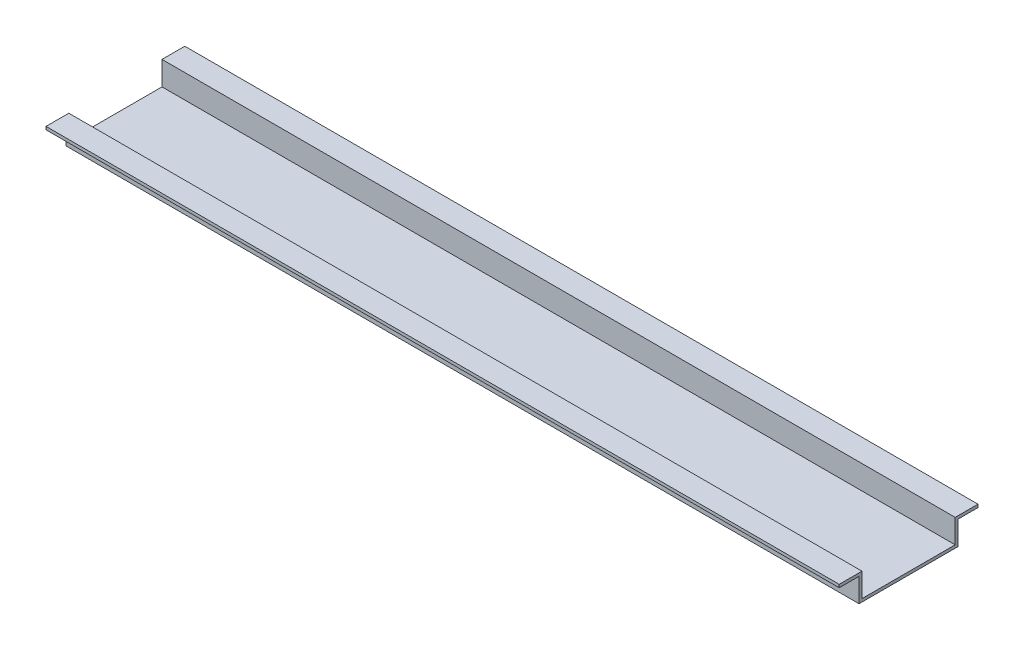
ISO-10303-21;
HEADER;
FILE_DESCRIPTION(('STEP AP214'),'2;1');
FILE_NAME('part.step','',(''),(''),'','','');
FILE_SCHEMA(('AUTOMOTIVE_DESIGN { 1 0 10303 214 1 1 1 1 }'));
ENDSEC;
DATA;
#1=APPLICATION_CONTEXT('core data for automotive mechanical design processes');
#2=APPLICATION_PROTOCOL_DEFINITION('international standard','automotive_design',2000,#1);
#3=PRODUCT_CONTEXT('',#1,'mechanical');
#4=PRODUCT('Part','Part','',(#3));
#5=PRODUCT_RELATED_PRODUCT_CATEGORY('part','',(#4));
#6=PRODUCT_DEFINITION_FORMATION('','',#4);
#7=PRODUCT_DEFINITION_CONTEXT('part definition',#1,'design');
#8=PRODUCT_DEFINITION('design','',#6,#7);
#9=PRODUCT_DEFINITION_SHAPE('','',#8);
#10=(LENGTH_UNIT() NAMED_UNIT(*) SI_UNIT(.MILLI.,.METRE.));
#11=(NAMED_UNIT(*) PLANE_ANGLE_UNIT() SI_UNIT($,.RADIAN.));
#12=(NAMED_UNIT(*) SI_UNIT($,.STERADIAN.) SOLID_ANGLE_UNIT());
#13=UNCERTAINTY_MEASURE_WITH_UNIT(LENGTH_MEASURE(1.E-05),#10,'distance_accuracy_value','');
#14=(GEOMETRIC_REPRESENTATION_CONTEXT(3) GLOBAL_UNCERTAINTY_ASSIGNED_CONTEXT((#13)) GLOBAL_UNIT_ASSIGNED_CONTEXT((#10,
#11,#12)) REPRESENTATION_CONTEXT('',''));
#15=CARTESIAN_POINT('',(0.,0.,0.));
#16=DIRECTION('',(0.,0.,1.));
#17=DIRECTION('',(1.,0.,0.));
#18=AXIS2_PLACEMENT_3D('',#15,#16,#17);
#19=CARTESIAN_POINT('',(271.289901108082,498.5,865.));
#20=DIRECTION('',(0.,0.,1.));
#21=DIRECTION('',(1.,0.,0.));
#22=AXIS2_PLACEMENT_3D('',#19,#20,#21);
#23=PLANE('',#22);
#24=DIRECTION('',(-1.,0.,0.));
#25=VECTOR('',#24,1.);
#26=CARTESIAN_POINT('',(271.289901108082,497.,865.));
#27=LINE('',#26,#25);
#28=CARTESIAN_POINT('',(200.,497.,865.));
#29=VERTEX_POINT('',#28);
#30=CARTESIAN_POINT('',(-200.,497.,865.));
#31=VERTEX_POINT('',#30);
#32=EDGE_CURVE('E158',#29,#31,#27,.T.);
#33=ORIENTED_EDGE('',*,*,#32,.T.);
#34=DIRECTION('',(0.,1.,0.));
#35=VECTOR('',#34,1.);
#36=CARTESIAN_POINT('',(-200.,498.5,865.));
#37=LINE('',#36,#35);
#38=CARTESIAN_POINT('',(-200.,498.5,865.));
#39=VERTEX_POINT('',#38);
#40=EDGE_CURVE('E155',#31,#39,#37,.T.);
#41=ORIENTED_EDGE('',*,*,#40,.T.);
#42=DIRECTION('',(-1.,0.,0.));
#43=VECTOR('',#42,1.);
#44=CARTESIAN_POINT('',(271.289901108082,498.5,865.));
#45=LINE('',#44,#43);
#46=CARTESIAN_POINT('',(200.,498.5,865.));
#47=VERTEX_POINT('',#46);
#48=EDGE_CURVE('E201',#47,#39,#45,.T.);
#49=ORIENTED_EDGE('',*,*,#48,.F.);
#50=DIRECTION('',(0.,1.,0.));
#51=VECTOR('',#50,1.);
#52=CARTESIAN_POINT('',(200.,498.5,865.));
#53=LINE('',#52,#51);
#54=EDGE_CURVE('E19',#29,#47,#53,.T.);
#55=ORIENTED_EDGE('',*,*,#54,.F.);
#56=EDGE_LOOP('',(#33,#41,#49,#55));
#57=FACE_BOUND('',#56,.T.);
#58=ADVANCED_FACE('F15',(#57),#23,.F.);
#59=CARTESIAN_POINT('',(271.289901108082,498.5,875.));
#60=DIRECTION('',(0.,-1.,0.));
#61=DIRECTION('',(0.,0.,1.));
#62=AXIS2_PLACEMENT_3D('',#59,#60,#61);
#63=PLANE('',#62);
#64=ORIENTED_EDGE('',*,*,#48,.T.);
#65=DIRECTION('',(0.,0.,1.));
#66=VECTOR('',#65,1.);
#67=CARTESIAN_POINT('',(-200.,498.5,875.));
#68=LINE('',#67,#66);
#69=CARTESIAN_POINT('',(-200.,498.5,876.5));
#70=VERTEX_POINT('',#69);
#71=EDGE_CURVE('E152',#39,#70,#68,.T.);
#72=ORIENTED_EDGE('',*,*,#71,.T.);
#73=DIRECTION('',(-1.,0.,0.));
#74=VECTOR('',#73,1.);
#75=CARTESIAN_POINT('',(271.289901108082,498.5,876.5));
#76=LINE('',#75,#74);
#77=CARTESIAN_POINT('',(200.,498.5,876.5));
#78=VERTEX_POINT('',#77);
#79=EDGE_CURVE('E199',#78,#70,#76,.T.);
#80=ORIENTED_EDGE('',*,*,#79,.F.);
#81=DIRECTION('',(0.,0.,1.));
#82=VECTOR('',#81,1.);
#83=CARTESIAN_POINT('',(200.,498.5,875.));
#84=LINE('',#83,#82);
#85=EDGE_CURVE('E160',#47,#78,#84,.T.);
#86=ORIENTED_EDGE('',*,*,#85,.F.);
#87=EDGE_LOOP('',(#64,#72,#80,#86));
#88=FACE_BOUND('',#87,.T.);
#89=ADVANCED_FACE('F212',(#88),#63,.F.);
#90=CARTESIAN_POINT('',(271.289901108082,485.,876.5));
#91=DIRECTION('',(0.,0.,-1.));
#92=DIRECTION('',(0.,-1.,0.));
#93=AXIS2_PLACEMENT_3D('',#90,#91,#92);
#94=PLANE('',#93);
#95=ORIENTED_EDGE('',*,*,#79,.T.);
#96=DIRECTION('',(0.,-1.,0.));
#97=VECTOR('',#96,1.);
#98=CARTESIAN_POINT('',(-200.,485.,876.5));
#99=LINE('',#98,#97);
#100=CARTESIAN_POINT('',(-200.,486.5,876.5));
#101=VERTEX_POINT('',#100);
#102=EDGE_CURVE('E149',#70,#101,#99,.T.);
#103=ORIENTED_EDGE('',*,*,#102,.T.);
#104=DIRECTION('',(-1.,0.,0.));
#105=VECTOR('',#104,1.);
#106=CARTESIAN_POINT('',(271.289901108082,486.5,876.5));
#107=LINE('',#106,#105);
#108=CARTESIAN_POINT('',(200.,486.5,876.5));
#109=VERTEX_POINT('',#108);
#110=EDGE_CURVE('E197',#109,#101,#107,.T.);
#111=ORIENTED_EDGE('',*,*,#110,.F.);
#112=DIRECTION('',(0.,-1.,0.));
#113=VECTOR('',#112,1.);
#114=CARTESIAN_POINT('',(200.,485.,876.5));
#115=LINE('',#114,#113);
#116=EDGE_CURVE('E32',#78,#109,#115,.T.);
#117=ORIENTED_EDGE('',*,*,#116,.F.);
#118=EDGE_LOOP('',(#95,#103,#111,#117));
#119=FACE_BOUND('',#118,.T.);
#120=ADVANCED_FACE('F233',(#119),#94,.F.);
#121=CARTESIAN_POINT('',(271.289901108082,486.5,875.000000000001));
#122=DIRECTION('',(0.,-1.,0.));
#123=DIRECTION('',(0.,0.,1.));
#124=AXIS2_PLACEMENT_3D('',#121,#122,#123);
#125=PLANE('',#124);
#126=ORIENTED_EDGE('',*,*,#110,.T.);
#127=DIRECTION('',(0.,0.,1.));
#128=VECTOR('',#127,1.);
#129=CARTESIAN_POINT('',(-200.,486.5,875.));
#130=LINE('',#129,#128);
#131=CARTESIAN_POINT('',(-200.,486.5,923.5));
#132=VERTEX_POINT('',#131);
#133=EDGE_CURVE('E146',#101,#132,#130,.T.);
#134=ORIENTED_EDGE('',*,*,#133,.T.);
#135=DIRECTION('',(-1.,0.,0.));
#136=VECTOR('',#135,1.);
#137=CARTESIAN_POINT('',(271.289901108082,486.5,923.500000000001));
#138=LINE('',#137,#136);
#139=CARTESIAN_POINT('',(200.,486.5,923.500000000001));
#140=VERTEX_POINT('',#139);
#141=EDGE_CURVE('E194',#140,#132,#138,.T.);
#142=ORIENTED_EDGE('',*,*,#141,.F.);
#143=DIRECTION('',(0.,0.,1.));
#144=VECTOR('',#143,1.);
#145=CARTESIAN_POINT('',(200.,486.5,875.000000000001));
#146=LINE('',#145,#144);
#147=EDGE_CURVE('E40',#109,#140,#146,.T.);
#148=ORIENTED_EDGE('',*,*,#147,.F.);
#149=EDGE_LOOP('',(#126,#134,#142,#148));
#150=FACE_BOUND('',#149,.T.);
#151=ADVANCED_FACE('F232',(#150),#125,.F.);
#152=CARTESIAN_POINT('',(271.289901108082,485.,923.500000000001));
#153=DIRECTION('',(0.,0.,1.));
#154=DIRECTION('',(1.,0.,0.));
#155=AXIS2_PLACEMENT_3D('',#152,#153,#154);
#156=PLANE('',#155);
#157=ORIENTED_EDGE('',*,*,#141,.T.);
#158=DIRECTION('',(0.,1.,0.));
#159=VECTOR('',#158,1.);
#160=CARTESIAN_POINT('',(-200.,485.,923.5));
#161=LINE('',#160,#159);
#162=CARTESIAN_POINT('',(-200.,498.5,923.5));
#163=VERTEX_POINT('',#162);
#164=EDGE_CURVE('E143',#132,#163,#161,.T.);
#165=ORIENTED_EDGE('',*,*,#164,.T.);
#166=DIRECTION('',(-1.,0.,0.));
#167=VECTOR('',#166,1.);
#168=CARTESIAN_POINT('',(271.289901108082,498.5,923.500000000001));
#169=LINE('',#168,#167);
#170=CARTESIAN_POINT('',(200.,498.5,923.500000000001));
#171=VERTEX_POINT('',#170);
#172=EDGE_CURVE('E191',#171,#163,#169,.T.);
#173=ORIENTED_EDGE('',*,*,#172,.F.);
#174=DIRECTION('',(0.,1.,0.));
#175=VECTOR('',#174,1.);
#176=CARTESIAN_POINT('',(200.,485.,923.500000000001));
#177=LINE('',#176,#175);
#178=EDGE_CURVE('E164',#140,#171,#177,.T.);
#179=ORIENTED_EDGE('',*,*,#178,.F.);
#180=EDGE_LOOP('',(#157,#165,#173,#179));
#181=FACE_BOUND('',#180,.T.);
#182=ADVANCED_FACE('F231',(#181),#156,.F.);
#183=CARTESIAN_POINT('',(271.289901108082,498.5,925.000000000001));
#184=DIRECTION('',(0.,-1.,0.));
#185=DIRECTION('',(0.,0.,1.));
#186=AXIS2_PLACEMENT_3D('',#183,#184,#185);
#187=PLANE('',#186);
#188=ORIENTED_EDGE('',*,*,#172,.T.);
#189=DIRECTION('',(0.,0.,1.));
#190=VECTOR('',#189,1.);
#191=CARTESIAN_POINT('',(-200.,498.5,925.));
#192=LINE('',#191,#190);
#193=CARTESIAN_POINT('',(-200.,498.5,935.));
#194=VERTEX_POINT('',#193);
#195=EDGE_CURVE('E140',#163,#194,#192,.T.);
#196=ORIENTED_EDGE('',*,*,#195,.T.);
#197=DIRECTION('',(-1.,0.,0.));
#198=VECTOR('',#197,1.);
#199=CARTESIAN_POINT('',(271.289901108082,498.5,935.000000000001));
#200=LINE('',#199,#198);
#201=CARTESIAN_POINT('',(200.,498.5,935.000000000001));
#202=VERTEX_POINT('',#201);
#203=EDGE_CURVE('E188',#202,#194,#200,.T.);
#204=ORIENTED_EDGE('',*,*,#203,.F.);
#205=DIRECTION('',(0.,0.,1.));
#206=VECTOR('',#205,1.);
#207=CARTESIAN_POINT('',(200.,498.5,925.000000000001));
#208=LINE('',#207,#206);
#209=EDGE_CURVE('E167',#171,#202,#208,.T.);
#210=ORIENTED_EDGE('',*,*,#209,.F.);
#211=EDGE_LOOP('',(#188,#196,#204,#210));
#212=FACE_BOUND('',#211,.T.);
#213=ADVANCED_FACE('F228',(#212),#187,.F.);
#214=CARTESIAN_POINT('',(271.289901108082,497.,935.000000000001));
#215=DIRECTION('',(0.,0.,-1.));
#216=DIRECTION('',(-1.,0.,0.));
#217=AXIS2_PLACEMENT_3D('',#214,#215,#216);
#218=PLANE('',#217);
#219=ORIENTED_EDGE('',*,*,#203,.T.);
#220=DIRECTION('',(0.,-1.,0.));
#221=VECTOR('',#220,1.);
#222=CARTESIAN_POINT('',(-200.,497.,935.));
#223=LINE('',#222,#221);
#224=CARTESIAN_POINT('',(-200.,497.,935.));
#225=VERTEX_POINT('',#224);
#226=EDGE_CURVE('E137',#194,#225,#223,.T.);
#227=ORIENTED_EDGE('',*,*,#226,.T.);
#228=DIRECTION('',(-1.,0.,0.));
#229=VECTOR('',#228,1.);
#230=CARTESIAN_POINT('',(271.289901108082,497.,935.000000000001));
#231=LINE('',#230,#229);
#232=CARTESIAN_POINT('',(200.,497.,935.000000000001));
#233=VERTEX_POINT('',#232);
#234=EDGE_CURVE('E185',#233,#225,#231,.T.);
#235=ORIENTED_EDGE('',*,*,#234,.F.);
#236=DIRECTION('',(0.,-1.,0.));
#237=VECTOR('',#236,1.);
#238=CARTESIAN_POINT('',(200.,497.,935.000000000001));
#239=LINE('',#238,#237);
#240=EDGE_CURVE('E170',#202,#233,#239,.T.);
#241=ORIENTED_EDGE('',*,*,#240,.F.);
#242=EDGE_LOOP('',(#219,#227,#235,#241));
#243=FACE_BOUND('',#242,.T.);
#244=ADVANCED_FACE('F225',(#243),#218,.F.);
#245=CARTESIAN_POINT('',(271.289901108082,497.,925.000000000001));
#246=DIRECTION('',(0.,-1.,0.));
#247=DIRECTION('',(0.,0.,1.));
#248=AXIS2_PLACEMENT_3D('',#245,#246,#247);
#249=PLANE('',#248);
#250=DIRECTION('',(0.,0.,1.));
#251=VECTOR('',#250,1.);
#252=CARTESIAN_POINT('',(200.,497.,925.000000000001));
#253=LINE('',#252,#251);
#254=CARTESIAN_POINT('',(200.,497.,925.));
#255=VERTEX_POINT('',#254);
#256=EDGE_CURVE('E173',#255,#233,#253,.T.);
#257=ORIENTED_EDGE('',*,*,#256,.T.);
#258=ORIENTED_EDGE('',*,*,#234,.T.);
#259=DIRECTION('',(0.,0.,1.));
#260=VECTOR('',#259,1.);
#261=CARTESIAN_POINT('',(-200.,497.,925.));
#262=LINE('',#261,#260);
#263=CARTESIAN_POINT('',(-200.,497.,925.));
#264=VERTEX_POINT('',#263);
#265=EDGE_CURVE('E133',#264,#225,#262,.T.);
#266=ORIENTED_EDGE('',*,*,#265,.F.);
#267=DIRECTION('',(-1.,0.,0.));
#268=VECTOR('',#267,1.);
#269=CARTESIAN_POINT('',(271.289901108082,497.,925.000000000001));
#270=LINE('',#269,#268);
#271=EDGE_CURVE('E182',#255,#264,#270,.T.);
#272=ORIENTED_EDGE('',*,*,#271,.F.);
#273=EDGE_LOOP('',(#257,#258,#266,#272));
#274=FACE_BOUND('',#273,.T.);
#275=ADVANCED_FACE('F223',(#274),#249,.T.);
#276=CARTESIAN_POINT('',(271.289901108082,485.,925.000000000001));
#277=DIRECTION('',(0.,0.,1.));
#278=DIRECTION('',(1.,0.,0.));
#279=AXIS2_PLACEMENT_3D('',#276,#277,#278);
#280=PLANE('',#279);
#281=DIRECTION('',(0.,1.,0.));
#282=VECTOR('',#281,1.);
#283=CARTESIAN_POINT('',(200.,485.,925.000000000001));
#284=LINE('',#283,#282);
#285=CARTESIAN_POINT('',(200.,485.,925.000000000001));
#286=VERTEX_POINT('',#285);
#287=EDGE_CURVE('E175',#286,#255,#284,.T.);
#288=ORIENTED_EDGE('',*,*,#287,.T.);
#289=ORIENTED_EDGE('',*,*,#271,.T.);
#290=DIRECTION('',(0.,1.,0.));
#291=VECTOR('',#290,1.);
#292=CARTESIAN_POINT('',(-200.,485.,925.));
#293=LINE('',#292,#291);
#294=CARTESIAN_POINT('',(-200.,485.,925.));
#295=VERTEX_POINT('',#294);
#296=EDGE_CURVE('E131',#295,#264,#293,.T.);
#297=ORIENTED_EDGE('',*,*,#296,.F.);
#298=DIRECTION('',(-1.,0.,0.));
#299=VECTOR('',#298,1.);
#300=CARTESIAN_POINT('',(271.289901108082,485.,925.000000000001));
#301=LINE('',#300,#299);
#302=EDGE_CURVE('E126',#286,#295,#301,.T.);
#303=ORIENTED_EDGE('',*,*,#302,.F.);
#304=EDGE_LOOP('',(#288,#289,#297,#303));
#305=FACE_BOUND('',#304,.T.);
#306=ADVANCED_FACE('F218',(#305),#280,.T.);
#307=CARTESIAN_POINT('',(271.289901108082,485.,875.000000000001));
#308=DIRECTION('',(0.,-1.,0.));
#309=DIRECTION('',(0.,0.,1.));
#310=AXIS2_PLACEMENT_3D('',#307,#308,#309);
#311=PLANE('',#310);
#312=DIRECTION('',(0.,0.,1.));
#313=VECTOR('',#312,1.);
#314=CARTESIAN_POINT('',(200.,485.,875.000000000001));
#315=LINE('',#314,#313);
#316=CARTESIAN_POINT('',(200.,485.,875.));
#317=VERTEX_POINT('',#316);
#318=EDGE_CURVE('E177',#317,#286,#315,.T.);
#319=ORIENTED_EDGE('',*,*,#318,.T.);
#320=ORIENTED_EDGE('',*,*,#302,.T.);
#321=DIRECTION('',(0.,0.,1.));
#322=VECTOR('',#321,1.);
#323=CARTESIAN_POINT('',(-200.,485.,875.));
#324=LINE('',#323,#322);
#325=CARTESIAN_POINT('',(-200.,485.,875.));
#326=VERTEX_POINT('',#325);
#327=EDGE_CURVE('E112',#326,#295,#324,.T.);
#328=ORIENTED_EDGE('',*,*,#327,.F.);
#329=DIRECTION('',(-1.,0.,0.));
#330=VECTOR('',#329,1.);
#331=CARTESIAN_POINT('',(271.289901108082,485.,875.000000000001));
#332=LINE('',#331,#330);
#333=EDGE_CURVE('E120',#317,#326,#332,.T.);
#334=ORIENTED_EDGE('',*,*,#333,.F.);
#335=EDGE_LOOP('',(#319,#320,#328,#334));
#336=FACE_BOUND('',#335,.T.);
#337=ADVANCED_FACE('F128',(#336),#311,.T.);
#338=CARTESIAN_POINT('',(271.289901108082,485.,875.000000000001));
#339=DIRECTION('',(0.,0.,-1.));
#340=DIRECTION('',(0.,-1.,0.));
#341=AXIS2_PLACEMENT_3D('',#338,#339,#340);
#342=PLANE('',#341);
#343=DIRECTION('',(0.,-1.,0.));
#344=VECTOR('',#343,1.);
#345=CARTESIAN_POINT('',(200.,485.,875.000000000001));
#346=LINE('',#345,#344);
#347=CARTESIAN_POINT('',(200.,497.,875.));
#348=VERTEX_POINT('',#347);
#349=EDGE_CURVE('E24',#348,#317,#346,.T.);
#350=ORIENTED_EDGE('',*,*,#349,.T.);
#351=ORIENTED_EDGE('',*,*,#333,.T.);
#352=DIRECTION('',(0.,-1.,0.));
#353=VECTOR('',#352,1.);
#354=CARTESIAN_POINT('',(-200.,485.,875.));
#355=LINE('',#354,#353);
#356=CARTESIAN_POINT('',(-200.,497.,875.));
#357=VERTEX_POINT('',#356);
#358=EDGE_CURVE('E107',#357,#326,#355,.T.);
#359=ORIENTED_EDGE('',*,*,#358,.F.);
#360=DIRECTION('',(-1.,0.,0.));
#361=VECTOR('',#360,1.);
#362=CARTESIAN_POINT('',(271.289901108082,497.,875.));
#363=LINE('',#362,#361);
#364=EDGE_CURVE('E125',#348,#357,#363,.T.);
#365=ORIENTED_EDGE('',*,*,#364,.F.);
#366=EDGE_LOOP('',(#350,#351,#359,#365));
#367=FACE_BOUND('',#366,.T.);
#368=ADVANCED_FACE('F121',(#367),#342,.T.);
#369=CARTESIAN_POINT('',(271.289901108082,497.,875.));
#370=DIRECTION('',(0.,-1.,0.));
#371=DIRECTION('',(0.,0.,1.));
#372=AXIS2_PLACEMENT_3D('',#369,#370,#371);
#373=PLANE('',#372);
#374=DIRECTION('',(0.,0.,1.));
#375=VECTOR('',#374,1.);
#376=CARTESIAN_POINT('',(200.,497.,875.));
#377=LINE('',#376,#375);
#378=EDGE_CURVE('E10',#29,#348,#377,.T.);
#379=ORIENTED_EDGE('',*,*,#378,.T.);
#380=ORIENTED_EDGE('',*,*,#364,.T.);
#381=DIRECTION('',(0.,0.,1.));
#382=VECTOR('',#381,1.);
#383=CARTESIAN_POINT('',(-200.,497.,875.));
#384=LINE('',#383,#382);
#385=EDGE_CURVE('E114',#31,#357,#384,.T.);
#386=ORIENTED_EDGE('',*,*,#385,.F.);
#387=ORIENTED_EDGE('',*,*,#32,.F.);
#388=EDGE_LOOP('',(#379,#380,#386,#387));
#389=FACE_BOUND('',#388,.T.);
#390=ADVANCED_FACE('F17',(#389),#373,.T.);
#391=CARTESIAN_POINT('',(200.,497.,640.210098891919));
#392=DIRECTION('',(-1.,0.,0.));
#393=DIRECTION('',(0.,0.,1.));
#394=AXIS2_PLACEMENT_3D('',#391,#392,#393);
#395=PLANE('',#394);
#396=ORIENTED_EDGE('',*,*,#378,.F.);
#397=ORIENTED_EDGE('',*,*,#54,.T.);
#398=ORIENTED_EDGE('',*,*,#85,.T.);
#399=ORIENTED_EDGE('',*,*,#116,.T.);
#400=ORIENTED_EDGE('',*,*,#147,.T.);
#401=ORIENTED_EDGE('',*,*,#178,.T.);
#402=ORIENTED_EDGE('',*,*,#209,.T.);
#403=ORIENTED_EDGE('',*,*,#240,.T.);
#404=ORIENTED_EDGE('',*,*,#256,.F.);
#405=ORIENTED_EDGE('',*,*,#287,.F.);
#406=ORIENTED_EDGE('',*,*,#318,.F.);
#407=ORIENTED_EDGE('',*,*,#349,.F.);
#408=EDGE_LOOP('',(#396,#397,#398,#399,#400,#401,#402,#403,#404,#405,#406,#407));
#409=FACE_BOUND('',#408,.T.);
#410=ADVANCED_FACE('F214',(#409),#395,.F.);
#411=CARTESIAN_POINT('',(-200.,497.,640.210098891919));
#412=DIRECTION('',(1.,0.,0.));
#413=DIRECTION('',(0.,0.,-1.));
#414=AXIS2_PLACEMENT_3D('',#411,#412,#413);
#415=PLANE('',#414);
#416=ORIENTED_EDGE('',*,*,#40,.F.);
#417=ORIENTED_EDGE('',*,*,#385,.T.);
#418=ORIENTED_EDGE('',*,*,#358,.T.);
#419=ORIENTED_EDGE('',*,*,#327,.T.);
#420=ORIENTED_EDGE('',*,*,#296,.T.);
#421=ORIENTED_EDGE('',*,*,#265,.T.);
#422=ORIENTED_EDGE('',*,*,#226,.F.);
#423=ORIENTED_EDGE('',*,*,#195,.F.);
#424=ORIENTED_EDGE('',*,*,#164,.F.);
#425=ORIENTED_EDGE('',*,*,#133,.F.);
#426=ORIENTED_EDGE('',*,*,#102,.F.);
#427=ORIENTED_EDGE('',*,*,#71,.F.);
#428=EDGE_LOOP('',(#416,#417,#418,#419,#420,#421,#422,#423,#424,#425,#426,#427));
#429=FACE_BOUND('',#428,.T.);
#430=ADVANCED_FACE('F110',(#429),#415,.F.);
#431=CLOSED_SHELL('',(#58,#89,#120,#151,#182,#213,#244,#275,#306,#337,#368,#390,#410,#430));
#432=MANIFOLD_SOLID_BREP('B1',#431);
#433=ADVANCED_BREP_SHAPE_REPRESENTATION('',(#18,#432),#14);
#434=SHAPE_DEFINITION_REPRESENTATION(#9,#433);
ENDSEC;
END-ISO-10303-21;
